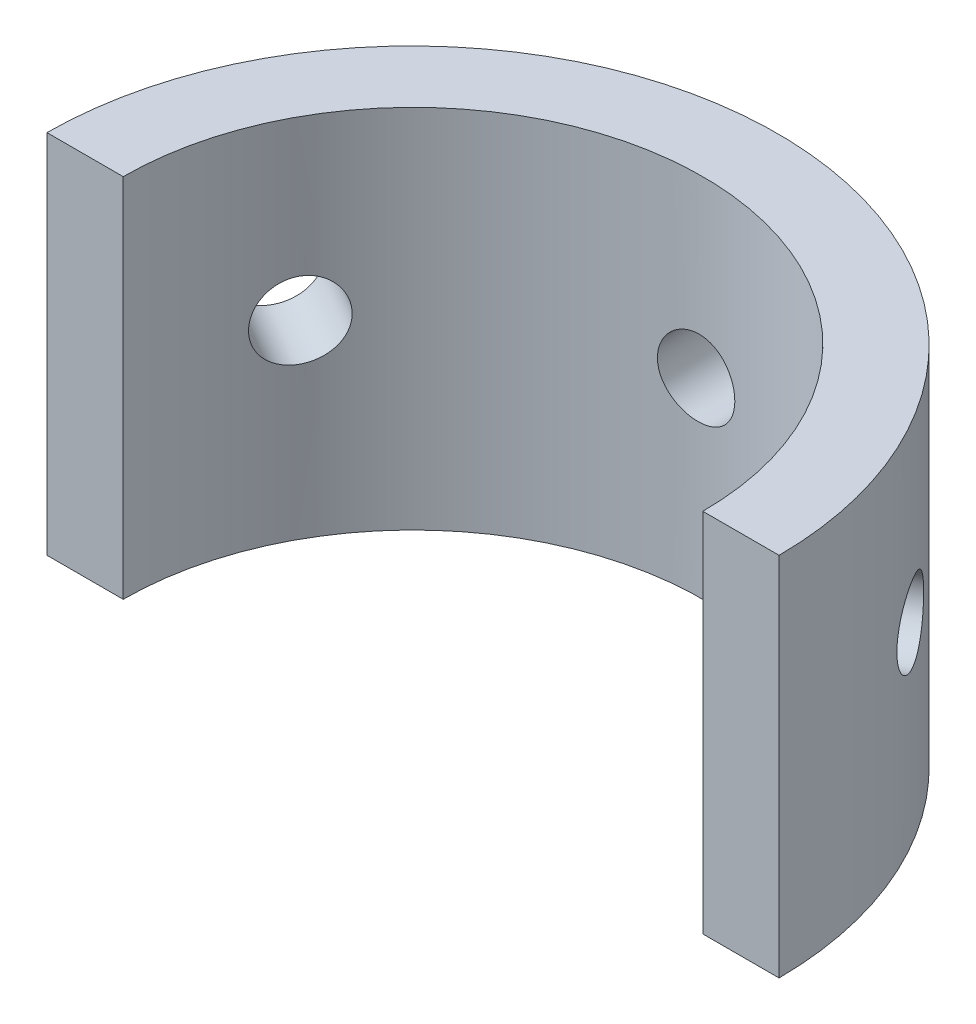
ISO-10303-21;
HEADER;
FILE_DESCRIPTION(('STEP AP214'),'2;1');
FILE_NAME('part.step','',(''),(''),'','','');
FILE_SCHEMA(('AUTOMOTIVE_DESIGN { 1 0 10303 214 1 1 1 1 }'));
ENDSEC;
DATA;
#1=APPLICATION_CONTEXT('core data for automotive mechanical design processes');
#2=APPLICATION_PROTOCOL_DEFINITION('international standard','automotive_design',2000,#1);
#3=PRODUCT_CONTEXT('',#1,'mechanical');
#4=PRODUCT('Part','Part','',(#3));
#5=PRODUCT_RELATED_PRODUCT_CATEGORY('part','',(#4));
#6=PRODUCT_DEFINITION_FORMATION('','',#4);
#7=PRODUCT_DEFINITION_CONTEXT('part definition',#1,'design');
#8=PRODUCT_DEFINITION('design','',#6,#7);
#9=PRODUCT_DEFINITION_SHAPE('','',#8);
#10=(LENGTH_UNIT() NAMED_UNIT(*) SI_UNIT(.MILLI.,.METRE.));
#11=(NAMED_UNIT(*) PLANE_ANGLE_UNIT() SI_UNIT($,.RADIAN.));
#12=(NAMED_UNIT(*) SI_UNIT($,.STERADIAN.) SOLID_ANGLE_UNIT());
#13=UNCERTAINTY_MEASURE_WITH_UNIT(LENGTH_MEASURE(1.E-05),#10,'distance_accuracy_value','');
#14=(GEOMETRIC_REPRESENTATION_CONTEXT(3) GLOBAL_UNCERTAINTY_ASSIGNED_CONTEXT((#13)) GLOBAL_UNIT_ASSIGNED_CONTEXT((#10,
#11,#12)) REPRESENTATION_CONTEXT('',''));
#15=CARTESIAN_POINT('',(0.,0.,0.));
#16=DIRECTION('',(0.,0.,1.));
#17=DIRECTION('',(1.,0.,0.));
#18=AXIS2_PLACEMENT_3D('',#15,#16,#17);
#19=CARTESIAN_POINT('',(-78.9587156753441,30.48,-2.73869468769838E-12));
#20=DIRECTION('',(0.,0.,-1.));
#21=DIRECTION('',(-1.,0.,0.));
#22=AXIS2_PLACEMENT_3D('',#19,#20,#21);
#23=PLANE('',#22);
#24=DIRECTION('',(0.,-1.,0.));
#25=VECTOR('',#24,1.);
#26=CARTESIAN_POINT('',(-24.3487156753441,30.48,-2.73869468769838E-12));
#27=LINE('',#26,#25);
#28=CARTESIAN_POINT('',(-24.3487156753441,0.,-2.73869468769838E-12));
#29=VERTEX_POINT('',#28);
#30=CARTESIAN_POINT('',(-24.3487156753441,30.48,-2.73869468769838E-12));
#31=VERTEX_POINT('',#30);
#32=EDGE_CURVE('E177',#29,#31,#27,.F.);
#33=ORIENTED_EDGE('',*,*,#32,.F.);
#34=DIRECTION('',(1.,0.,0.));
#35=VECTOR('',#34,1.);
#36=CARTESIAN_POINT('',(-78.9587156753441,0.,-2.73869468769838E-12));
#37=LINE('',#36,#35);
#38=CARTESIAN_POINT('',(-17.9987156753441,0.,-2.74482042997293E-12));
#39=VERTEX_POINT('',#38);
#40=EDGE_CURVE('E97',#29,#39,#37,.T.);
#41=ORIENTED_EDGE('',*,*,#40,.T.);
#42=DIRECTION('',(0.,-1.,0.));
#43=VECTOR('',#42,1.);
#44=CARTESIAN_POINT('',(-17.9987156753441,30.48,-2.74482042997293E-12));
#45=LINE('',#44,#43);
#46=CARTESIAN_POINT('',(-17.9987156753441,30.48,-2.74482042997293E-12));
#47=VERTEX_POINT('',#46);
#48=EDGE_CURVE('E11',#47,#39,#45,.T.);
#49=ORIENTED_EDGE('',*,*,#48,.F.);
#50=DIRECTION('',(1.,0.,0.));
#51=VECTOR('',#50,1.);
#52=CARTESIAN_POINT('',(-78.9587156753441,30.48,-2.73869468769838E-12));
#53=LINE('',#52,#51);
#54=EDGE_CURVE('E102',#31,#47,#53,.T.);
#55=ORIENTED_EDGE('',*,*,#54,.F.);
#56=EDGE_LOOP('',(#33,#41,#49,#55));
#57=FACE_BOUND('',#56,.T.);
#58=ADVANCED_FACE('F39',(#57),#23,.F.);
#59=DIRECTION('',(0.,-1.,0.));
#60=VECTOR('',#59,1.);
#61=CARTESIAN_POINT('',(-72.6087156753441,30.48,-2.73869468769838E-12));
#62=LINE('',#61,#60);
#63=CARTESIAN_POINT('',(-72.6087156753441,30.48,-2.73869468769838E-12));
#64=VERTEX_POINT('',#63);
#65=CARTESIAN_POINT('',(-72.6087156753441,0.,-2.73869468769838E-12));
#66=VERTEX_POINT('',#65);
#67=EDGE_CURVE('E61',#64,#66,#62,.T.);
#68=ORIENTED_EDGE('',*,*,#67,.F.);
#69=CARTESIAN_POINT('',(-78.9587156753441,30.48,-2.73736654003709E-12));
#70=VERTEX_POINT('',#69);
#71=EDGE_CURVE('E85',#70,#64,#53,.T.);
#72=ORIENTED_EDGE('',*,*,#71,.F.);
#73=DIRECTION('',(0.,-1.,0.));
#74=VECTOR('',#73,1.);
#75=CARTESIAN_POINT('',(-78.9587156753441,30.48,-2.73736654003709E-12));
#76=LINE('',#75,#74);
#77=CARTESIAN_POINT('',(-78.9587156753441,0.,-2.73736654003709E-12));
#78=VERTEX_POINT('',#77);
#79=EDGE_CURVE('E53',#70,#78,#76,.T.);
#80=ORIENTED_EDGE('',*,*,#79,.T.);
#81=EDGE_CURVE('E83',#78,#66,#37,.T.);
#82=ORIENTED_EDGE('',*,*,#81,.T.);
#83=EDGE_LOOP('',(#68,#72,#80,#82));
#84=FACE_BOUND('',#83,.T.);
#85=ADVANCED_FACE('F82',(#84),#23,.F.);
#86=CARTESIAN_POINT('',(-48.4787156753441,30.48,0.130335836696666));
#87=DIRECTION('',(0.,-1.,0.));
#88=DIRECTION('',(0.,0.,-1.));
#89=AXIS2_PLACEMENT_3D('',#86,#87,#88);
#90=CYLINDRICAL_SURFACE('',#89,30.4802786639218);
#91=CARTESIAN_POINT('',(-73.3467646108194,15.7989352991086,-17.4942926579167));
#92=CARTESIAN_POINT('',(-73.346770237791,15.6209873842544,-17.4942870608213));
#93=CARTESIAN_POINT('',(-73.3554916133903,15.4429228734124,-17.4819989610618));
#94=CARTESIAN_POINT('',(-73.3900389751096,15.0917298112064,-17.4330983540216));
#95=CARTESIAN_POINT('',(-73.415883652257,14.9186068694741,-17.3964592661584));
#96=CARTESIAN_POINT('',(-73.4835847740129,14.5824296934561,-17.2997350882543));
#97=CARTESIAN_POINT('',(-73.5254318663035,14.419369642622,-17.2396636923851));
#98=CARTESIAN_POINT('',(-73.6234216037065,14.1078406955678,-17.0975069857288));
#99=CARTESIAN_POINT('',(-73.6795614103432,13.9593689102813,-17.0154260457768));
#100=CARTESIAN_POINT('',(-73.8041044163524,13.6807213915714,-16.8309276464342));
#101=CARTESIAN_POINT('',(-73.8725420319882,13.5505988821954,-16.7284530251062));
#102=CARTESIAN_POINT('',(-74.0189657964422,13.3128069411958,-16.5057913799886));
#103=CARTESIAN_POINT('',(-74.0969523323885,13.2051384203708,-16.3856036380411));
#104=CARTESIAN_POINT('',(-74.2597296801126,13.0151856924689,-16.1303410647692));
#105=CARTESIAN_POINT('',(-74.3445293276488,12.9329351413807,-15.9952468139863));
#106=CARTESIAN_POINT('',(-74.5178754542668,12.796382256854,-15.7138059848958));
#107=CARTESIAN_POINT('',(-74.6064218283404,12.7420791407034,-15.5674597218505));
#108=CARTESIAN_POINT('',(-74.783997717073,12.6631471904409,-15.2680307350608));
#109=CARTESIAN_POINT('',(-74.8730241742117,12.6384078271272,-15.1149753348613));
#110=CARTESIAN_POINT('',(-75.0491572302263,12.6189450988681,-14.8058837923124));
#111=CARTESIAN_POINT('',(-75.1362638731693,12.6242210442364,-14.6498477185345));
#112=CARTESIAN_POINT('',(-75.3058550790225,12.6645523508899,-14.3397411557125));
#113=CARTESIAN_POINT('',(-75.3883527474614,12.6995181573616,-14.1856661684056));
#114=CARTESIAN_POINT('',(-75.5469453881087,12.7980787449647,-13.883495321835));
#115=CARTESIAN_POINT('',(-75.6230402294159,12.8616741112386,-13.7353995848451));
#116=CARTESIAN_POINT('',(-75.7673667003924,13.0158928428888,-13.4491600163141));
#117=CARTESIAN_POINT('',(-75.8355745671061,13.1065950804137,-13.3110467070209));
#118=CARTESIAN_POINT('',(-75.9625694558088,13.3123944463013,-13.0494345498947));
#119=CARTESIAN_POINT('',(-76.0213561524301,13.4274924168716,-12.92593620684));
#120=CARTESIAN_POINT('',(-76.1288168020913,13.6795068646793,-12.6968004103027));
#121=CARTESIAN_POINT('',(-76.1774387916613,13.8165294219541,-12.5912552239592));
#122=CARTESIAN_POINT('',(-76.2635081795571,14.1081405371132,-12.4021627543479));
#123=CARTESIAN_POINT('',(-76.3009556075523,14.2627290483571,-12.3186154126742));
#124=CARTESIAN_POINT('',(-76.364193088183,14.5850317520838,-12.1763138537606));
#125=CARTESIAN_POINT('',(-76.3899898207577,14.7527383584116,-12.1175454307874));
#126=CARTESIAN_POINT('',(-76.4296665339678,15.0965831310161,-12.0267284473381));
#127=CARTESIAN_POINT('',(-76.443547000198,15.2727209534071,-11.9946787980582));
#128=CARTESIAN_POINT('',(-76.4592003592086,15.6273263154925,-11.95851263085));
#129=CARTESIAN_POINT('',(-76.4610435079002,15.8057742346081,-11.9542340278659));
#130=CARTESIAN_POINT('',(-76.4527903123546,16.1609031400382,-11.9733264054362));
#131=CARTESIAN_POINT('',(-76.4426941825393,16.3375841580276,-11.9966968894306));
#132=CARTESIAN_POINT('',(-76.4107105602407,16.6836779060449,-12.0701818355872));
#133=CARTESIAN_POINT('',(-76.3888550084008,16.8531089886291,-12.1202238497639));
#134=CARTESIAN_POINT('',(-76.3336085938617,17.1804628017738,-12.2453248068305));
#135=CARTESIAN_POINT('',(-76.3002174071244,17.3383852089026,-12.3203844524682));
#136=CARTESIAN_POINT('',(-76.2221202340834,17.6390024381027,-12.4934476284027));
#137=CARTESIAN_POINT('',(-76.1773651536711,17.7816272686001,-12.5915505685484));
#138=CARTESIAN_POINT('',(-76.0772119043817,18.0468948383411,-12.8073807627539));
#139=CARTESIAN_POINT('',(-76.0218133743625,18.1695368992901,-12.9251086826891));
#140=CARTESIAN_POINT('',(-75.9009232869863,18.3919927911891,-13.1771626121757));
#141=CARTESIAN_POINT('',(-75.8353818593433,18.4916874207059,-13.3115699460787));
#142=CARTESIAN_POINT('',(-75.6956125376213,18.6646079546468,-13.592363405565));
#143=CARTESIAN_POINT('',(-75.6213847324555,18.7378341299692,-13.7387494085306));
#144=CARTESIAN_POINT('',(-75.465929619935,18.8556148299985,-14.0388619622023));
#145=CARTESIAN_POINT('',(-75.3847119948254,18.9002083140415,-14.1925782314647));
#146=CARTESIAN_POINT('',(-75.2171732761295,18.9595580612638,-14.502960367212));
#147=CARTESIAN_POINT('',(-75.1308523526635,18.9743153184672,-14.659626135256));
#148=CARTESIAN_POINT('',(-74.9559356739612,18.9735423941618,-14.9705203429083));
#149=CARTESIAN_POINT('',(-74.8673542629219,18.9581710243437,-15.124757265889));
#150=CARTESIAN_POINT('',(-74.6901244603575,18.8978921817387,-15.4273048914526));
#151=CARTESIAN_POINT('',(-74.6014760692308,18.8529848832448,-15.5756156290007));
#152=CARTESIAN_POINT('',(-74.42706918939,18.7350051339239,-15.8621140151593));
#153=CARTESIAN_POINT('',(-74.3413072068455,18.6619681713478,-16.0003141588776));
#154=CARTESIAN_POINT('',(-74.1754688185617,18.4898117637506,-16.2632132577801));
#155=CARTESIAN_POINT('',(-74.0953923679459,18.3906925246285,-16.3879123195338));
#156=CARTESIAN_POINT('',(-73.9434819243289,18.1687297176272,-16.6211580754324));
#157=CARTESIAN_POINT('',(-73.8716812711942,18.0457951937668,-16.7296399244066));
#158=CARTESIAN_POINT('',(-73.7393636480442,17.779868479349,-16.927249962422));
#159=CARTESIAN_POINT('',(-73.6788493960207,17.6368714718336,-17.0163734904397));
#160=CARTESIAN_POINT('',(-73.5713242271555,17.3343952984929,-17.1733485161616));
#161=CARTESIAN_POINT('',(-73.524355845191,17.1748663076859,-17.2411330678542));
#162=CARTESIAN_POINT('',(-73.4461314193091,16.8443154320387,-17.3533783421941));
#163=CARTESIAN_POINT('',(-73.4148578964056,16.6733065738633,-17.3978650135445));
#164=CARTESIAN_POINT('',(-73.3770495340648,16.384280746551,-17.451501304109));
#165=CARTESIAN_POINT('',(-73.3657141999391,16.2680996090353,-17.4675295450481));
#166=CARTESIAN_POINT('',(-73.3505698913014,16.0342744121899,-17.4889270533307));
#167=CARTESIAN_POINT('',(-73.3467608891306,15.916630358238,-17.4942963598452));
#168=CARTESIAN_POINT('',(-73.3467646108194,15.7989352991086,-17.4942926579167));
#169=B_SPLINE_CURVE_WITH_KNOTS('',3,(#91,#92,#93,#94,#95,#96,#97,#98,#99,#100,#101,#102,#103,
#104,#105,#106,#107,#108,#109,#110,#111,#112,#113,#114,#115,#116,#117,#118,#119,#120,#121,#122,
#123,#124,#125,#126,#127,#128,#129,#130,#131,#132,#133,#134,#135,#136,#137,#138,#139,#140,#141,
#142,#143,#144,#145,#146,#147,#148,#149,#150,#151,#152,#153,#154,#155,#156,#157,#158,#159,#160,
#161,#162,#163,#164,#165,#166,#167,#168),.UNSPECIFIED.,.T.,.F.,(4,2,2,2,2,2,2,2,2,2,2,2,2,2,2,2,
2,2,2,2,2,2,2,2,2,2,2,2,2,2,2,2,2,2,2,2,2,2,4),(0.,0.533414256726589,1.06741172590308,
1.6010975858472,2.13467754048085,2.66977469505046,3.2048935504836,3.74071795169633,
4.27652734548314,4.81032719257647,5.34411477416249,5.87629796547446,6.40849203425385,
6.94224994542831,7.47602628639548,8.01246802137171,8.54890833204197,9.0850406823874,
9.6211511839929,10.1541298540337,10.6870989522611,11.218627667818,11.7501713153273,
12.2840516059505,12.8179500148186,13.3545621594635,13.8911688118602,14.4270437694691,
14.9629008735669,15.4959410042976,16.0289779895595,16.5613446891148,17.0937071861825,
17.6281444751876,18.1627103016953,18.6989368641406,19.2345649113686,19.58736732129,
19.9401684346792),.UNSPECIFIED.);
#170=CARTESIAN_POINT('',(-73.3467646108194,15.7989352991086,-17.4942926579167));
#171=VERTEX_POINT('',#170);
#172=EDGE_CURVE('E116',#171,#171,#169,.T.);
#173=ORIENTED_EDGE('',*,*,#172,.F.);
#174=EDGE_LOOP('',(#173));
#175=FACE_BOUND('',#174,.T.);
#176=CARTESIAN_POINT('',(-20.7813151990084,15.7989352991086,-12.5937120366731));
#177=CARTESIAN_POINT('',(-20.7813172327493,15.6209873842544,-12.5937197083211));
#178=CARTESIAN_POINT('',(-20.7875983515057,15.4429228734124,-12.6074166910259));
#179=CARTESIAN_POINT('',(-20.8126738386033,15.0917298112064,-12.6617858874285));
#180=CARTESIAN_POINT('',(-20.8314818808906,14.9186068694741,-12.7024875783224));
#181=CARTESIAN_POINT('',(-20.8813969152378,14.5824296934561,-12.8094805585798));
#182=CARTESIAN_POINT('',(-20.912496723956,14.419369642622,-12.8757569015125));
#183=CARTESIAN_POINT('',(-20.9866131745372,14.1078406955678,-13.0316968567419));
#184=CARTESIAN_POINT('',(-21.0296274503838,13.9593689102813,-13.1213558254288));
#185=CARTESIAN_POINT('',(-21.1271362481675,13.6807213915714,-13.3214624321677));
#186=CARTESIAN_POINT('',(-21.1816630656628,13.5505988821954,-13.4319684565467));
#187=CARTESIAN_POINT('',(-21.3012818245561,13.3128069411958,-13.6701059788404));
#188=CARTESIAN_POINT('',(-21.3663741943329,13.2051384203708,-13.7977381710969));
#189=CARTESIAN_POINT('',(-21.5060493935598,13.0151856924689,-14.0663387760225));
#190=CARTESIAN_POINT('',(-21.5806446228748,12.9329351413807,-14.2073245504123));
#191=CARTESIAN_POINT('',(-21.7377064672204,12.796382256854,-14.4981671142564));
#192=CARTESIAN_POINT('',(-21.8201728617297,12.7420791407034,-14.6480236551398));
#193=CARTESIAN_POINT('',(-21.9906980265527,12.6631471904409,-14.9515233792767));
#194=CARTESIAN_POINT('',(-22.0787346627426,12.6384078271272,-15.1051502528674));
#195=CARTESIAN_POINT('',(-22.2583492626776,12.6189450988681,-15.4122317250968));
#196=CARTESIAN_POINT('',(-22.3499271450045,12.6242210442364,-15.5656863276127));
#197=CARTESIAN_POINT('',(-22.533691703362,12.6645523508899,-15.867609901551));
#198=CARTESIAN_POINT('',(-22.6258757222381,12.6995181573616,-16.0160924718255));
#199=CARTESIAN_POINT('',(-22.8082670313276,12.7980787449647,-16.3045231507646));
#200=CARTESIAN_POINT('',(-22.8984742810995,12.8616741112386,-16.4444710849286));
#201=CARTESIAN_POINT('',(-23.0742017835273,13.0158928428888,-16.7125812594983));
#202=CARTESIAN_POINT('',(-23.1597074846192,13.1065950804137,-16.8407076594569));
#203=CARTESIAN_POINT('',(-23.322772814278,13.3123944463013,-17.0814945377873));
#204=CARTESIAN_POINT('',(-23.400332168378,13.4274924168716,-17.1941544819932));
#205=CARTESIAN_POINT('',(-23.5450392642651,13.6795068646793,-17.4017860327757));
#206=CARTESIAN_POINT('',(-23.6121330821007,13.8165294219541,-17.4966665040976));
#207=CARTESIAN_POINT('',(-23.7328572705005,14.1081405371132,-17.6657510153092));
#208=CARTESIAN_POINT('',(-23.786487676811,14.2627290483571,-17.7399551100962));
#209=CARTESIAN_POINT('',(-23.8781057015129,14.5850317520838,-17.8658711542506));
#210=CARTESIAN_POINT('',(-23.9161022824607,14.7527383584116,-17.9175959914815));
#211=CARTESIAN_POINT('',(-23.9749137406178,15.0965831310161,-17.9973655247848));
#212=CARTESIAN_POINT('',(-23.9957293179616,15.2727209534071,-18.0254111857964));
#213=CARTESIAN_POINT('',(-24.0192234580161,15.6273263154925,-18.0570504759583));
#214=CARTESIAN_POINT('',(-24.0220072625472,15.8057742346081,-18.0607859910402));
#215=CARTESIAN_POINT('',(-24.0095993763254,16.1609031400382,-18.0440923252501));
#216=CARTESIAN_POINT('',(-23.9944080083952,16.3375841580276,-18.023663578353));
#217=CARTESIAN_POINT('',(-23.9467599893772,16.6836779060449,-17.959222475859));
#218=CARTESIAN_POINT('',(-23.9143501097636,16.8531089886291,-17.9152740056636));
#219=CARTESIAN_POINT('',(-23.8336327101757,17.1804628017738,-17.8048787286715));
#220=CARTESIAN_POINT('',(-23.785324743623,17.3383852089026,-17.7384312898756));
#221=CARTESIAN_POINT('',(-23.6744962233247,17.6390024381027,-17.5842655660911));
#222=CARTESIAN_POINT('',(-23.6119141251786,17.7816272686001,-17.4964550594328));
#223=CARTESIAN_POINT('',(-23.4750763187377,18.0468948383411,-17.3018047041738));
#224=CARTESIAN_POINT('',(-23.4008202143486,18.1695368992901,-17.1949642098773));
#225=CARTESIAN_POINT('',(-23.2429801519778,18.3919927911891,-16.9642433584005));
#226=CARTESIAN_POINT('',(-23.1593507001842,18.4916874207059,-16.8402791501099));
#227=CARTESIAN_POINT('',(-22.9860610919136,18.6646079546468,-16.5788386370858));
#228=CARTESIAN_POINT('',(-22.8964009971699,18.7378341299692,-16.4413624706622));
#229=CARTESIAN_POINT('',(-22.7142234579557,18.8556148299985,-16.1566781172355));
#230=CARTESIAN_POINT('',(-22.6217100763544,18.9002083140415,-16.0094834560243));
#231=CARTESIAN_POINT('',(-22.4366806212642,18.9595580612638,-15.7091996016425));
#232=CARTESIAN_POINT('',(-22.3441645479678,18.9743153184672,-15.5561106050209));
#233=CARTESIAN_POINT('',(-22.1623806056026,18.9735423941618,-15.2491812138929));
#234=CARTESIAN_POINT('',(-22.0730982176194,18.9581710243437,-15.0953490001394));
#235=CARTESIAN_POINT('',(-21.8996991893089,18.8978921817387,-14.7905896760292));
#236=CARTESIAN_POINT('',(-21.8155825185016,18.8529848832448,-14.6396625485347));
#237=CARTESIAN_POINT('',(-21.6546710778654,18.7350051339239,-14.3453725669186));
#238=CARTESIAN_POINT('',(-21.5778672338709,18.6619681713478,-14.202000439497));
#239=CARTESIAN_POINT('',(-21.4331091297312,18.4898117637506,-13.9269306328692));
#240=CARTESIAN_POINT('',(-21.3651547997323,18.3906925246285,-13.7952328615143));
#241=CARTESIAN_POINT('',(-21.2391132716077,18.1687297176272,-13.5470516802924));
#242=CARTESIAN_POINT('',(-21.1810655611139,18.0457951937668,-13.4306295661824));
#243=CARTESIAN_POINT('',(-21.0760890597247,17.779868479349,-13.2172341241584));
#244=CARTESIAN_POINT('',(-21.0291629463982,17.6368714718336,-13.1202654806062));
#245=CARTESIAN_POINT('',(-20.946981170796,17.3343952984929,-12.9486584399618));
#246=CARTESIAN_POINT('',(-20.9117622180283,17.1748663076859,-12.8740903521596));
#247=CARTESIAN_POINT('',(-20.8536671719361,16.8443154320387,-12.7502233749795));
#248=CARTESIAN_POINT('',(-20.8307773458687,16.6733065738633,-12.7008963740039));
#249=CARTESIAN_POINT('',(-20.8032311368454,16.384280746551,-12.6413352264591));
#250=CARTESIAN_POINT('',(-20.795017940077,16.2680996090353,-12.6235044186763));
#251=CARTESIAN_POINT('',(-20.7840593086454,16.0342744121899,-12.599690308532));
#252=CARTESIAN_POINT('',(-20.7813138538886,15.916630358238,-12.5937069626317));
#253=CARTESIAN_POINT('',(-20.7813151990084,15.7989352991086,-12.5937120366731));
#254=B_SPLINE_CURVE_WITH_KNOTS('',3,(#176,#177,#178,#179,#180,#181,#182,#183,#184,#185,#186,
#187,#188,#189,#190,#191,#192,#193,#194,#195,#196,#197,#198,#199,#200,#201,#202,#203,#204,#205,
#206,#207,#208,#209,#210,#211,#212,#213,#214,#215,#216,#217,#218,#219,#220,#221,#222,#223,#224,
#225,#226,#227,#228,#229,#230,#231,#232,#233,#234,#235,#236,#237,#238,#239,#240,#241,#242,#243,
#244,#245,#246,#247,#248,#249,#250,#251,#252,#253),.UNSPECIFIED.,.T.,.F.,(4,2,2,2,2,2,2,2,2,2,2,
2,2,2,2,2,2,2,2,2,2,2,2,2,2,2,2,2,2,2,2,2,2,2,2,2,2,2,4),(0.,0.533414256726587,1.06741172590307,
1.60109758584721,2.13467754048085,2.66977469505046,3.2048935504836,3.74071795169634,
4.27652734548314,4.81032719257648,5.3441147741625,5.87629796547445,6.40849203425385,
6.94224994542831,7.47602628639549,8.01246802137172,8.54890833204197,9.0850406823874,
9.62115118399289,10.1541298540337,10.6870989522611,11.218627667818,11.7501713153273,
12.2840516059504,12.8179500148186,13.3545621594635,13.8911688118601,14.4270437694691,
14.9629008735669,15.4959410042976,16.0289779895595,16.5613446891148,17.0937071861825,
17.6281444751876,18.1627103016953,18.6989368641406,19.2345649113686,19.58736732129,
19.9401684346792),.UNSPECIFIED.);
#255=CARTESIAN_POINT('',(-20.7813151990084,15.7989352991086,-12.5937120366731));
#256=VERTEX_POINT('',#255);
#257=EDGE_CURVE('E154',#256,#256,#254,.T.);
#258=ORIENTED_EDGE('',*,*,#257,.F.);
#259=EDGE_LOOP('',(#258));
#260=FACE_BOUND('',#259,.T.);
#261=CARTESIAN_POINT('',(-45.6493641344834,15.7989352991086,-30.2183405312861));
#262=CARTESIAN_POINT('',(-45.6493717951961,15.6209873842544,-30.2183426058388));
#263=CARTESIAN_POINT('',(-45.6643742895517,15.4429228734124,-30.219751488784));
#264=CARTESIAN_POINT('',(-45.7239971383686,15.0917298112064,-30.2252200781465));
#265=CARTESIAN_POINT('',(-45.7686498578033,14.9186068694741,-30.2292826811772));
#266=CARTESIAN_POINT('',(-45.8862660139064,14.5824296934561,-30.2395514835305));
#267=CARTESIAN_POINT('',(-45.9592129149151,14.419369642622,-30.2457564305941));
#268=CARTESIAN_POINT('',(-46.1313191028994,14.1078406955678,-30.2595396791671));
#269=CARTESIAN_POINT('',(-46.2304731853827,13.9593689102813,-30.267117707902));
#270=CARTESIAN_POINT('',(-46.4525249891755,13.6807213915714,-30.2827259152983));
#271=CARTESIAN_POINT('',(-46.5754894223067,13.5505988821954,-30.2907573183493));
#272=CARTESIAN_POINT('',(-46.8415319456539,13.3128069411958,-30.3062331955255));
#273=CARTESIAN_POINT('',(-46.9846108513771,13.2051384203708,-30.3136776458344));
#274=CARTESIAN_POINT('',(-47.287063398328,13.0151856924689,-30.3270156774881));
#275=CARTESIAN_POINT('',(-47.4464582751793,12.9329351413807,-30.3329072010951));
#276=CARTESIAN_POINT('',(-47.7768662461429,12.796382256854,-30.3423089358486));
#277=CARTESIAN_POINT('',(-47.9478790147258,12.7420791407034,-30.3458192136867));
#278=CARTESIAN_POINT('',(-48.2959800682815,12.6631471904409,-30.3498899510339));
#279=CARTESIAN_POINT('',(-48.47304316161,12.6384078271272,-30.3504614244251));
#280=CARTESIAN_POINT('',(-48.8287908175596,12.6189450988681,-30.3484513541055));
#281=CARTESIAN_POINT('',(-49.0074753428295,12.6242210442364,-30.3458698828436));
#282=CARTESIAN_POINT('',(-49.3608311070401,12.6645523508899,-30.3376868939599));
#283=CARTESIAN_POINT('',(-49.5355127943551,12.6995181573616,-30.3320944769275));
#284=CARTESIAN_POINT('',(-49.876496744092,12.7980787449647,-30.3183543092961));
#285=CARTESIAN_POINT('',(-50.0427988351711,12.8616741112386,-30.3102065064701));
#286=CARTESIAN_POINT('',(-50.3628528085754,13.0158928428888,-30.2920771125088));
#287=CARTESIAN_POINT('',(-50.516566376381,13.1065950804137,-30.2820902031742));
#288=CARTESIAN_POINT('',(-50.8066265947424,13.3123944463013,-30.2612649243784));
#289=CARTESIAN_POINT('',(-50.9429726454637,13.4274924168716,-30.2504265255297));
#290=CARTESIAN_POINT('',(-51.1951403910121,13.6795068646793,-30.2289222797748));
#291=CARTESIAN_POINT('',(-51.3108561984177,13.8165294219541,-30.2182575647532));
#292=CARTESIAN_POINT('',(-51.5176497747133,14.1081405371132,-30.1982496063535));
#293=CARTESIAN_POINT('',(-51.6087276090189,14.2627290483571,-30.1889063594669));
#294=CARTESIAN_POINT('',(-51.7635831143516,14.5850317520838,-30.1725208447076));
#295=CARTESIAN_POINT('',(-51.8273764278741,14.7527383584116,-30.1654772589653));
#296=CARTESIAN_POINT('',(-51.9258645992413,15.0965831310161,-30.1544298088193));
#297=CARTESIAN_POINT('',(-51.9605606428151,15.2727209534071,-30.150425820551));
#298=CARTESIAN_POINT('',(-51.9997081418803,15.6273263154925,-30.1458989435047));
#299=CARTESIAN_POINT('',(-52.004335095103,15.8057742346081,-30.1453558556025));
#300=CARTESIAN_POINT('',(-51.9836740133357,16.1609031400382,-30.1477545673828));
#301=CARTESIAN_POINT('',(-51.9583865155902,16.3375841580276,-30.15069630448));
#302=CARTESIAN_POINT('',(-51.8787548742735,16.6836779060449,-30.1597401481427));
#303=CARTESIAN_POINT('',(-51.82448944282,16.8531089886291,-30.165833692124));
#304=CARTESIAN_POINT('',(-51.688525628693,17.1804628017738,-30.1805393721984));
#305=CARTESIAN_POINT('',(-51.6068264754031,17.3383852089026,-30.1891515790403));
#306=CARTESIAN_POINT('',(-51.4179007820637,17.6390024381027,-30.2080490311902));
#307=CARTESIAN_POINT('',(-51.3105636035054,17.7816272686001,-30.2183414646777));
#308=CARTESIAN_POINT('',(-51.073572547775,18.0468948383411,-30.2395213036242));
#309=CARTESIAN_POINT('',(-50.9439179133668,18.1695368992901,-30.2504087292629));
#310=CARTESIAN_POINT('',(-50.6651877636197,18.3919927911891,-30.2717418072726));
#311=CARTESIAN_POINT('',(-50.5160168841832,18.4916874207059,-30.2821849328851));
#312=CARTESIAN_POINT('',(-50.2029579541906,18.6646079546468,-30.3015378793472));
#313=CARTESIAN_POINT('',(-50.039070054281,18.7378341299692,-30.3104477158892));
#314=CARTESIAN_POINT('',(-49.7014374025464,18.8556148299985,-30.3258759161342));
#315=CARTESIAN_POINT('',(-49.5277063958354,18.9002083140415,-30.3323975241854));
#316=CARTESIAN_POINT('',(-49.1751382220494,18.9595580612638,-30.342495805551));
#317=CARTESIAN_POINT('',(-48.996301225287,18.9743153184672,-30.3460725769732));
#318=CARTESIAN_POINT('',(-48.6396006042195,18.9735423941618,-30.3500373934976));
#319=CARTESIAN_POINT('',(-48.461736805197,18.9581710243437,-30.3504421027249));
#320=CARTESIAN_POINT('',(-48.111107974322,18.8978921817387,-30.3482304041782));
#321=CARTESIAN_POINT('',(-47.938342912388,18.8529848832448,-30.3456140142318));
#322=CARTESIAN_POINT('',(-47.6030245919111,18.7350051339239,-30.3378224187743));
#323=CARTESIAN_POINT('',(-47.4404587653721,18.6619681713478,-30.332650435071));
#324=CARTESIAN_POINT('',(-47.1298622729486,18.4898117637506,-30.3204797273458));
#325=CARTESIAN_POINT('',(-46.9818314923339,18.3906925246285,-30.3134810177444));
#326=CARTESIAN_POINT('',(-46.7038795205923,18.1687297176272,-30.2985455924213));
#327=CARTESIAN_POINT('',(-46.5740311569638,18.0457951937668,-30.2906053272854));
#328=CARTESIAN_POINT('',(-46.3367370324247,17.779868479349,-30.2748199232769));
#329=CARTESIAN_POINT('',(-46.2292966670746,17.6368714718336,-30.2669748077423));
#330=CARTESIAN_POINT('',(-46.0395897226072,17.3343952984929,-30.2523427928197));
#331=CARTESIAN_POINT('',(-45.957402387875,17.1748663076859,-30.2455592567102));
#332=CARTESIAN_POINT('',(-45.821082915901,16.8443154320387,-30.23393755387));
#333=CARTESIAN_POINT('',(-45.7669195669299,16.6733065738633,-30.2290972242448));
#334=CARTESIAN_POINT('',(-45.7015649955659,16.384280746551,-30.2231723672645));
#335=CARTESIAN_POINT('',(-45.6820164646718,16.2680996090353,-30.2213698004208));
#336=CARTESIAN_POINT('',(-45.6559135246025,16.0342744121899,-30.2189531985591));
#337=CARTESIAN_POINT('',(-45.6493590676749,15.916630358238,-30.2183391591733));
#338=CARTESIAN_POINT('',(-45.6493641344834,15.7989352991086,-30.2183405312861));
#339=B_SPLINE_CURVE_WITH_KNOTS('',3,(#261,#262,#263,#264,#265,#266,#267,#268,#269,#270,#271,
#272,#273,#274,#275,#276,#277,#278,#279,#280,#281,#282,#283,#284,#285,#286,#287,#288,#289,#290,
#291,#292,#293,#294,#295,#296,#297,#298,#299,#300,#301,#302,#303,#304,#305,#306,#307,#308,#309,
#310,#311,#312,#313,#314,#315,#316,#317,#318,#319,#320,#321,#322,#323,#324,#325,#326,#327,#328,
#329,#330,#331,#332,#333,#334,#335,#336,#337,#338),.UNSPECIFIED.,.T.,.F.,(4,2,2,2,2,2,2,2,2,2,2,
2,2,2,2,2,2,2,2,2,2,2,2,2,2,2,2,2,2,2,2,2,2,2,2,2,2,2,4),(0.,0.533414256726587,1.06741172590307,
1.60109758584721,2.13467754048085,2.66977469505046,3.2048935504836,3.74071795169634,
4.27652734548314,4.81032719257647,5.34411477416249,5.87629796547445,6.40849203425385,
6.9422499454283,7.47602628639548,8.01246802137171,8.54890833204196,9.0850406823874,
9.62115118399289,10.1541298540337,10.6870989522611,11.218627667818,11.7501713153273,
12.2840516059504,12.8179500148186,13.3545621594635,13.8911688118601,14.4270437694691,
14.9629008735669,15.4959410042976,16.0289779895595,16.5613446891148,17.0937071861825,
17.6281444751876,18.1627103016953,18.6989368641406,19.2345649113686,19.58736732129,
19.9401684346792),.UNSPECIFIED.);
#340=CARTESIAN_POINT('',(-45.6493641344834,15.7989352991086,-30.2183405312861));
#341=VERTEX_POINT('',#340);
#342=EDGE_CURVE('E115',#341,#341,#339,.T.);
#343=ORIENTED_EDGE('',*,*,#342,.F.);
#344=EDGE_LOOP('',(#343));
#345=FACE_BOUND('',#344,.T.);
#346=CARTESIAN_POINT('',(-48.4787156753441,0.,0.130335836696666));
#347=DIRECTION('',(0.,-1.,0.));
#348=DIRECTION('',(0.,0.,-1.));
#349=AXIS2_PLACEMENT_3D('',#346,#347,#348);
#350=CIRCLE('',#349,30.4802786639218);
#351=EDGE_CURVE('E94',#78,#39,#350,.T.);
#352=ORIENTED_EDGE('',*,*,#351,.F.);
#353=ORIENTED_EDGE('',*,*,#79,.F.);
#354=CARTESIAN_POINT('',(-48.4787156753441,30.48,0.130335836696666));
#355=DIRECTION('',(0.,-1.,0.));
#356=DIRECTION('',(0.,0.,-1.));
#357=AXIS2_PLACEMENT_3D('',#354,#355,#356);
#358=CIRCLE('',#357,30.4802786639218);
#359=EDGE_CURVE('E88',#70,#47,#358,.T.);
#360=ORIENTED_EDGE('',*,*,#359,.T.);
#361=ORIENTED_EDGE('',*,*,#48,.T.);
#362=EDGE_LOOP('',(#352,#353,#360,#361));
#363=FACE_BOUND('',#362,.T.);
#364=ADVANCED_FACE('F99',(#175,#260,#345,#363),#90,.T.);
#365=CARTESIAN_POINT('',(-48.4787156753441,30.48,0.130335836696666));
#366=DIRECTION('',(0.,-1.,0.));
#367=DIRECTION('',(0.,0.,-1.));
#368=AXIS2_PLACEMENT_3D('',#365,#366,#367);
#369=PLANE('',#368);
#370=CARTESIAN_POINT('',(-48.4787156753441,30.48,0.));
#371=DIRECTION('',(0.,1.,0.));
#372=DIRECTION('',(0.,0.,1.));
#373=AXIS2_PLACEMENT_3D('',#370,#371,#372);
#374=CIRCLE('',#373,24.13);
#375=EDGE_CURVE('E145',#31,#64,#374,.T.);
#376=ORIENTED_EDGE('',*,*,#375,.F.);
#377=ORIENTED_EDGE('',*,*,#54,.T.);
#378=ORIENTED_EDGE('',*,*,#359,.F.);
#379=ORIENTED_EDGE('',*,*,#71,.T.);
#380=EDGE_LOOP('',(#376,#377,#378,#379));
#381=FACE_BOUND('',#380,.T.);
#382=ADVANCED_FACE('F150',(#381),#369,.F.);
#383=CARTESIAN_POINT('',(-48.4787156753441,0.,0.130335836696666));
#384=DIRECTION('',(0.,-1.,0.));
#385=DIRECTION('',(0.,0.,-1.));
#386=AXIS2_PLACEMENT_3D('',#383,#384,#385);
#387=PLANE('',#386);
#388=ORIENTED_EDGE('',*,*,#40,.F.);
#389=CARTESIAN_POINT('',(-48.4787156753441,0.,0.));
#390=DIRECTION('',(0.,1.,0.));
#391=DIRECTION('',(0.,0.,1.));
#392=AXIS2_PLACEMENT_3D('',#389,#390,#391);
#393=CIRCLE('',#392,24.13);
#394=EDGE_CURVE('E95',#29,#66,#393,.T.);
#395=ORIENTED_EDGE('',*,*,#394,.T.);
#396=ORIENTED_EDGE('',*,*,#81,.F.);
#397=ORIENTED_EDGE('',*,*,#351,.T.);
#398=EDGE_LOOP('',(#388,#395,#396,#397));
#399=FACE_BOUND('',#398,.T.);
#400=ADVANCED_FACE('F93',(#399),#387,.T.);
#401=CARTESIAN_POINT('',(-48.4787156753441,30.48,0.));
#402=DIRECTION('',(0.,-1.,0.));
#403=DIRECTION('',(0.,0.,-1.));
#404=AXIS2_PLACEMENT_3D('',#401,#402,#403);
#405=CYLINDRICAL_SURFACE('',#404,24.13);
#406=CARTESIAN_POINT('',(-67.8848271462321,15.7989352991086,-14.3408415924403));
#407=CARTESIAN_POINT('',(-67.8848330493525,15.976708684779,-14.3408363934761));
#408=CARTESIAN_POINT('',(-67.8937999509864,16.1545910737161,-14.3287240446166));
#409=CARTESIAN_POINT('',(-67.9292877161787,16.5054076537422,-14.2805115099779));
#410=CARTESIAN_POINT('',(-67.955826596734,16.678336575858,-14.2443867034662));
#411=CARTESIAN_POINT('',(-68.0252464786371,17.0141243571559,-14.1489749603041));
#412=CARTESIAN_POINT('',(-68.0681171644456,17.1769894975397,-14.0897026435543));
#413=CARTESIAN_POINT('',(-68.1683196245945,17.488171259652,-13.9493296469931));
#414=CARTESIAN_POINT('',(-68.2256489225875,17.6364903666651,-13.8682327049573));
#415=CARTESIAN_POINT('',(-68.3526328938159,17.915089283264,-13.6856383168809));
#416=CARTESIAN_POINT('',(-68.4223378059407,18.0452915518383,-13.5840574790197));
#417=CARTESIAN_POINT('',(-68.571097451863,18.2832809333879,-13.363038675696));
#418=CARTESIAN_POINT('',(-68.6501525487518,18.3910671754432,-13.2436000167212));
#419=CARTESIAN_POINT('',(-68.81470565726,18.5813225295416,-12.9895082533104));
#420=CARTESIAN_POINT('',(-68.9002142149478,18.6637490327913,-12.854830057362));
#421=CARTESIAN_POINT('',(-69.0744189259706,18.800644670011,-12.5738300982449));
#422=CARTESIAN_POINT('',(-69.1631149378638,18.8551150428859,-12.427508851382));
#423=CARTESIAN_POINT('',(-69.3401105655548,18.9342631816434,-12.128032060471));
#424=CARTESIAN_POINT('',(-69.4284093835314,18.9591170042714,-11.9749225723238));
#425=CARTESIAN_POINT('',(-69.6023715802746,18.9789110355867,-11.6653154199847));
#426=CARTESIAN_POINT('',(-69.6880350446833,18.9738522173915,-11.5088178661783));
#427=CARTESIAN_POINT('',(-69.8539643623388,18.9341004945576,-11.1976165507151));
#428=CARTESIAN_POINT('',(-69.9342519471069,18.8995357834079,-11.0429079593094));
#429=CARTESIAN_POINT('',(-70.0879093053378,18.8019923092886,-10.7391176235806));
#430=CARTESIAN_POINT('',(-70.1612788425623,18.739012576423,-10.5900360715146));
#431=CARTESIAN_POINT('',(-70.2999942060734,18.5860703922501,-10.3011907588438));
#432=CARTESIAN_POINT('',(-70.3652967685824,18.4959706631525,-10.1614789335928));
#433=CARTESIAN_POINT('',(-70.4863935670407,18.2914478177628,-9.89647779630067));
#434=CARTESIAN_POINT('',(-70.5421872630785,18.1770233211442,-9.77118930334413));
#435=CARTESIAN_POINT('',(-70.6439936672704,17.9259838479777,-9.53801348273754));
#436=CARTESIAN_POINT('',(-70.6899235898013,17.7891968281958,-9.43027514102813));
#437=CARTESIAN_POINT('',(-70.7710018709941,17.4978941776428,-9.23698529046655));
#438=CARTESIAN_POINT('',(-70.8061502886968,17.3433786439614,-9.15143366011785));
#439=CARTESIAN_POINT('',(-70.8653928826003,17.021137914508,-9.00554307129608));
#440=CARTESIAN_POINT('',(-70.8895007041796,16.8534293265869,-8.94517299851895));
#441=CARTESIAN_POINT('',(-70.926602712238,16.5094145678761,-8.8516565100794));
#442=CARTESIAN_POINT('',(-70.939597683523,16.333109005147,-8.81850817198448));
#443=CARTESIAN_POINT('',(-70.9543495854197,15.9787880785596,-8.78084230027268));
#444=CARTESIAN_POINT('',(-70.9562172634037,15.8008072843601,-8.77604262316214));
#445=CARTESIAN_POINT('',(-70.9490038980127,15.446534586843,-8.79449496688228));
#446=CARTESIAN_POINT('',(-70.9399231890421,15.2702426321076,-8.81774613093611));
#447=CARTESIAN_POINT('',(-70.910916587282,14.9251911324432,-8.8912764325573));
#448=CARTESIAN_POINT('',(-70.8910415249524,14.7564002637505,-8.94142887877188));
#449=CARTESIAN_POINT('',(-70.8405690373093,14.4301659134056,-9.06691574163965));
#450=CARTESIAN_POINT('',(-70.8099711245004,14.272722948058,-9.14225130319113));
#451=CARTESIAN_POINT('',(-70.7379666569444,13.9723805077614,-9.31619760882252));
#452=CARTESIAN_POINT('',(-70.6964823439232,13.8295963804182,-9.41497528662464));
#453=CARTESIAN_POINT('',(-70.60314479211,13.5637947286108,-9.63226264826262));
#454=CARTESIAN_POINT('',(-70.5512909508627,13.4407783533754,-9.75077347850067));
#455=CARTESIAN_POINT('',(-70.4372734126727,13.2168902386391,-10.0049073867835));
#456=CARTESIAN_POINT('',(-70.3750224391979,13.1162243617932,-10.1406727790349));
#457=CARTESIAN_POINT('',(-70.241456254267,12.9413000706637,-10.4242289987868));
#458=CARTESIAN_POINT('',(-70.1701411509633,12.867041341332,-10.5720196827947));
#459=CARTESIAN_POINT('',(-70.0199161579883,12.7472093380926,-10.8748367982168));
#460=CARTESIAN_POINT('',(-69.9410192239283,12.7015881000275,-11.0298506612964));
#461=CARTESIAN_POINT('',(-69.7773532090411,12.6402297358216,-11.3426663576161));
#462=CARTESIAN_POINT('',(-69.6925844559906,12.6244909429742,-11.5004680348691));
#463=CARTESIAN_POINT('',(-69.5202222836769,12.623413261506,-11.8128511845856));
#464=CARTESIAN_POINT('',(-69.432659463455,12.6378138345779,-11.9674486842062));
#465=CARTESIAN_POINT('',(-69.2566665916842,12.6960915959376,-12.2704671580793));
#466=CARTESIAN_POINT('',(-69.1682365529309,12.7399683499534,-12.4188882232948));
#467=CARTESIAN_POINT('',(-68.9936727887139,12.8557649203742,-12.7051758101955));
#468=CARTESIAN_POINT('',(-68.9075334457626,12.9276077334622,-12.8430700805263));
#469=CARTESIAN_POINT('',(-68.740330751751,13.0972842225512,-13.1052684934993));
#470=CARTESIAN_POINT('',(-68.6592674352922,13.1951180757002,-13.2295725435059));
#471=CARTESIAN_POINT('',(-68.5047808107909,13.4146673391839,-13.4622906150942));
#472=CARTESIAN_POINT('',(-68.4314045823967,13.5365180791221,-13.5706082108538));
#473=CARTESIAN_POINT('',(-68.295715228264,13.8003652014076,-13.7679996508871));
#474=CARTESIAN_POINT('',(-68.2334047358768,13.9423663645953,-13.85706891566));
#475=CARTESIAN_POINT('',(-68.1221701345951,14.2432778639182,-14.0143122435049));
#476=CARTESIAN_POINT('',(-68.0733140041941,14.4022686304308,-14.0823803987834));
#477=CARTESIAN_POINT('',(-67.9915747052782,14.7319893535051,-14.1954267798606));
#478=CARTESIAN_POINT('',(-67.9586746740617,14.9027066983416,-14.2404293846315));
#479=CARTESIAN_POINT('',(-67.9180337934392,15.1950406344091,-14.2958226115166));
#480=CARTESIAN_POINT('',(-67.9056077775783,15.3148408189288,-14.3126853216338));
#481=CARTESIAN_POINT('',(-67.889002463731,15.5560554797487,-14.3351965522656));
#482=CARTESIAN_POINT('',(-67.8848231128691,15.6774699456935,-14.340845144682));
#483=CARTESIAN_POINT('',(-67.8848271462321,15.7989352991086,-14.3408415924403));
#484=B_SPLINE_CURVE_WITH_KNOTS('',3,(#406,#407,#408,#409,#410,#411,#412,#413,#414,#415,#416,
#417,#418,#419,#420,#421,#422,#423,#424,#425,#426,#427,#428,#429,#430,#431,#432,#433,#434,#435,
#436,#437,#438,#439,#440,#441,#442,#443,#444,#445,#446,#447,#448,#449,#450,#451,#452,#453,#454,
#455,#456,#457,#458,#459,#460,#461,#462,#463,#464,#465,#466,#467,#468,#469,#470,#471,#472,#473,
#474,#475,#476,#477,#478,#479,#480,#481,#482,#483),.UNSPECIFIED.,.T.,.F.,(4,2,2,2,2,2,2,2,2,2,2,
2,2,2,2,2,2,2,2,2,2,2,2,2,2,2,2,2,2,2,2,2,2,2,2,2,2,2,4),(0.,0.532877097559431,1.06630141540354,
1.59938936745082,2.13238607868454,2.66759814201463,3.20283099582136,3.73895828425977,
4.27506181160973,4.80796229432139,5.34084544081816,5.87142509879723,6.40202286853402,
6.93535295828533,7.46871332032358,8.00638885922382,8.54406145369962,9.08106771836789,
9.61803605572884,10.1496510232712,10.6812497537297,11.2103666276767,11.7395075601012,
12.2725360300877,12.8055954773013,13.3433779286483,13.8811539638138,14.418026872247,
14.9548698354779,15.4870912599965,16.0193048434808,16.5500632493427,17.0808252728065,
17.6146682291481,18.1486380561965,18.6852582454179,19.2213100819631,19.5854057521233,
19.9494990877924),.UNSPECIFIED.);
#485=CARTESIAN_POINT('',(-67.8848271462321,15.7989352991086,-14.3408415924403));
#486=VERTEX_POINT('',#485);
#487=EDGE_CURVE('E42',#486,#486,#484,.T.);
#488=ORIENTED_EDGE('',*,*,#487,.F.);
#489=EDGE_LOOP('',(#488));
#490=FACE_BOUND('',#489,.T.);
#491=CARTESIAN_POINT('',(-26.2663358503817,15.7989352991086,-9.42693388709193));
#492=CARTESIAN_POINT('',(-26.2663373471753,15.9765855318613,-9.42694165458323));
#493=CARTESIAN_POINT('',(-26.2722115734209,16.1543447720677,-9.44081592230479));
#494=CARTESIAN_POINT('',(-26.2956956015283,16.5049147058121,-9.49586127777353));
#495=CARTESIAN_POINT('',(-26.3133174569607,16.6777201263825,-9.53706040177069));
#496=CARTESIAN_POINT('',(-26.3601955326652,17.0132604111262,-9.64527977398707));
#497=CARTESIAN_POINT('',(-26.3894440241025,17.176001882454,-9.71228286803289));
#498=CARTESIAN_POINT('',(-26.4593764535499,17.4869565495258,-9.86980197671919));
#499=CARTESIAN_POINT('',(-26.5000584806069,17.6351721674815,-9.96031406197409));
#500=CARTESIAN_POINT('',(-26.5927391575733,17.9136949624668,-10.1623475216351));
#501=CARTESIAN_POINT('',(-26.6447913183133,18.0439125369657,-10.2739678918291));
#502=CARTESIAN_POINT('',(-26.7595162804788,18.2819630748204,-10.5143223570803));
#503=CARTESIAN_POINT('',(-26.8221895557748,18.3897950389445,-10.6430572156604));
#504=CARTESIAN_POINT('',(-26.9574240326889,18.5802710823695,-10.913928966643));
#505=CARTESIAN_POINT('',(-27.0300106322704,18.6628486398303,-11.0560999845831));
#506=CARTESIAN_POINT('',(-27.1836073175338,18.8000303809772,-11.3491229770378));
#507=CARTESIAN_POINT('',(-27.2646170413486,18.8546357657831,-11.4999745785003));
#508=CARTESIAN_POINT('',(-27.4327440850556,18.9340225466198,-11.8048332061605));
#509=CARTESIAN_POINT('',(-27.5198223533148,18.9589788163365,-11.958816226578));
#510=CARTESIAN_POINT('',(-27.698249714696,18.9789208968914,-12.2662428377942));
#511=CARTESIAN_POINT('',(-27.7895986455538,18.9739078455002,-12.4196864488501));
#512=CARTESIAN_POINT('',(-27.9734120119118,18.9341904149599,-12.7208645490029));
#513=CARTESIAN_POINT('',(-28.0658680600017,18.8996422427324,-12.8686248077721));
#514=CARTESIAN_POINT('',(-28.2494434842493,18.8020991749864,-13.1553198902156));
#515=CARTESIAN_POINT('',(-28.3405628235069,18.7391034956855,-13.2942544706055));
#516=CARTESIAN_POINT('',(-28.5187440492874,18.5861768004181,-13.5603170956806));
#517=CARTESIAN_POINT('',(-28.6057878547226,18.496136882605,-13.6873946303328));
#518=CARTESIAN_POINT('',(-28.772283232333,18.291758215641,-13.9260412503505));
#519=CARTESIAN_POINT('',(-28.8517343948118,18.1774181563352,-14.037609498988));
#520=CARTESIAN_POINT('',(-29.0006083141989,17.9266081638648,-14.2434732926617));
#521=CARTESIAN_POINT('',(-29.0699472685402,17.7899712260681,-14.3376260620927));
#522=CARTESIAN_POINT('',(-29.1950230494447,17.4990135808184,-14.505415720264));
#523=CARTESIAN_POINT('',(-29.2507598848977,17.3446928849227,-14.5790526224125));
#524=CARTESIAN_POINT('',(-29.3462276631246,17.0227354955738,-14.7041157724504));
#525=CARTESIAN_POINT('',(-29.385964002721,16.8551033148417,-14.755549509689));
#526=CARTESIAN_POINT('',(-29.4476717064295,16.5112502069601,-14.835053828861));
#527=CARTESIAN_POINT('',(-29.4696441711884,16.3350298126524,-14.8631258582852));
#528=CARTESIAN_POINT('',(-29.4946992104764,15.9806447908933,-14.8951144541725));
#529=CARTESIAN_POINT('',(-29.4979444837838,15.8025104217602,-14.8992390737485));
#530=CARTESIAN_POINT('',(-29.4858314550447,15.4479135447069,-14.8837945986577));
#531=CARTESIAN_POINT('',(-29.4704736569521,15.2714509916281,-14.8642261458321));
#532=CARTESIAN_POINT('',(-29.4219642870525,14.925965110236,-14.8019815178727));
#533=CARTESIAN_POINT('',(-29.3888879560977,14.7569135715408,-14.7594030469161));
#534=CARTESIAN_POINT('',(-29.3064558105044,14.4301667118596,-14.6521636190312));
#535=CARTESIAN_POINT('',(-29.257099310735,14.2724718691463,-14.5875017327456));
#536=CARTESIAN_POINT('',(-29.1438309646763,13.9717729154023,-14.4370365887671));
#537=CARTESIAN_POINT('',(-29.0798254391356,13.8288723476818,-14.3510969591498));
#538=CARTESIAN_POINT('',(-28.9400621027484,13.5628723502508,-14.1602215328569));
#539=CARTESIAN_POINT('',(-28.8643036972247,13.4397739231397,-14.0552847749118));
#540=CARTESIAN_POINT('',(-28.7033679670308,13.2159219825397,-13.8279437394319));
#541=CARTESIAN_POINT('',(-28.6181236182506,13.1153448621566,-13.7054131228854));
#542=CARTESIAN_POINT('',(-28.4418834761129,12.9406028369872,-13.4464401789036));
#543=CARTESIAN_POINT('',(-28.3508877814714,12.8664374790148,-13.3099980902198));
#544=CARTESIAN_POINT('',(-28.1665878280793,12.7468332184002,-13.0270021172392));
#545=CARTESIAN_POINT('',(-28.0732894993626,12.7013271934377,-12.8804727585337));
#546=CARTESIAN_POINT('',(-27.8872759445608,12.6401446688756,-12.5809605441394));
#547=CARTESIAN_POINT('',(-27.7945606877073,12.6244665818817,-12.4279780323197));
#548=CARTESIAN_POINT('',(-27.6132856914616,12.6234348025304,-12.1211480360524));
#549=CARTESIAN_POINT('',(-27.5246983372987,12.6378360789359,-11.9673176431594));
#550=CARTESIAN_POINT('',(-27.353272804955,12.6960534617284,-11.6620418184929));
#551=CARTESIAN_POINT('',(-27.2704345802472,12.7398693300364,-11.510596367426));
#552=CARTESIAN_POINT('',(-27.1125721017925,12.8555401582002,-11.2148511336314));
#553=CARTESIAN_POINT('',(-27.0375355572682,12.9273501415125,-11.0705403051026));
#554=CARTESIAN_POINT('',(-26.8965832105658,13.0969522817841,-10.7931779150948));
#555=CARTESIAN_POINT('',(-26.8306675172197,13.1947447487311,-10.6601264879728));
#556=CARTESIAN_POINT('',(-26.7085892990714,13.4142894888157,-10.4085640591773));
#557=CARTESIAN_POINT('',(-26.652493348983,13.5361942115445,-10.2901537961948));
#558=CARTESIAN_POINT('',(-26.5512676506741,13.8001866965575,-10.0726537419232));
#559=CARTESIAN_POINT('',(-26.5061405058393,13.942279237654,-9.97356853843134));
#560=CARTESIAN_POINT('',(-26.4271118446616,14.2433695058379,-9.79760400751013));
#561=CARTESIAN_POINT('',(-26.3932636950744,14.4024430262843,-9.72083046083055));
#562=CARTESIAN_POINT('',(-26.3373584968193,14.7323579867204,-9.59281630852589));
#563=CARTESIAN_POINT('',(-26.3152888882834,14.9031866713635,-9.54154850920951));
#564=CARTESIAN_POINT('',(-26.2882237482991,15.1955412153302,-9.47838066240629));
#565=CARTESIAN_POINT('',(-26.2800191592104,15.3152416045829,-9.45912102564236));
#566=CARTESIAN_POINT('',(-26.2690747195763,15.5562561450951,-9.43339503297222));
#567=CARTESIAN_POINT('',(-26.2663348278197,15.6775702841779,-9.42692858058777));
#568=CARTESIAN_POINT('',(-26.2663358503817,15.7989352991086,-9.42693388709193));
#569=B_SPLINE_CURVE_WITH_KNOTS('',3,(#491,#492,#493,#494,#495,#496,#497,#498,#499,#500,#501,
#502,#503,#504,#505,#506,#507,#508,#509,#510,#511,#512,#513,#514,#515,#516,#517,#518,#519,#520,
#521,#522,#523,#524,#525,#526,#527,#528,#529,#530,#531,#532,#533,#534,#535,#536,#537,#538,#539,
#540,#541,#542,#543,#544,#545,#546,#547,#548,#549,#550,#551,#552,#553,#554,#555,#556,#557,#558,
#559,#560,#561,#562,#563,#564,#565,#566,#567,#568),.UNSPECIFIED.,.T.,.F.,(4,2,2,2,2,2,2,2,2,2,2,
2,2,2,2,2,2,2,2,2,2,2,2,2,2,2,2,2,2,2,2,2,2,2,2,2,2,2,4),(0.,0.532507657557917,1.06556253342841,
1.59826365074867,2.13087578753545,2.666050719752,3.20124953556004,3.73784619500127,
4.27441981115439,4.8078126928746,5.34118532472413,5.87175435608678,6.402338006517,
6.93508752917008,7.46786578258556,8.00483501953518,8.54180390554707,9.07859152479665,
9.61534588222301,10.1474299016607,10.6794995073591,11.2093274120072,11.7391776166518,
12.2725158371185,12.8058810524628,13.3432879836097,13.880685693217,14.4168200499189,
14.9529258736254,15.4846815332646,16.016432888974,16.5473334080123,17.0782402613219,
17.6126177286192,18.147121903899,18.6841203273777,19.2205449808359,19.5843400977752,
19.948132471187),.UNSPECIFIED.);
#570=CARTESIAN_POINT('',(-26.2663358503817,15.7989352991086,-9.42693388709193));
#571=VERTEX_POINT('',#570);
#572=EDGE_CURVE('E117',#571,#571,#569,.T.);
#573=ORIENTED_EDGE('',*,*,#572,.F.);
#574=EDGE_LOOP('',(#573));
#575=FACE_BOUND('',#574,.T.);
#576=CARTESIAN_POINT('',(-45.6493641344834,15.7989352991086,-23.9635487742995));
#577=CARTESIAN_POINT('',(-45.6493715989573,15.9766485732467,-23.9635513243292));
#578=CARTESIAN_POINT('',(-45.6643346583914,16.1544708531296,-23.9653309896431));
#579=CARTESIAN_POINT('',(-45.7237905777299,16.5051670279764,-23.9722370476581));
#580=CARTESIAN_POINT('',(-45.7683137568284,16.6780356519768,-23.9773668764632));
#581=CARTESIAN_POINT('',(-45.8855651871284,17.0137025632806,-23.9903298776643));
#582=CARTESIAN_POINT('',(-45.9582751744984,17.1765072925123,-23.998161299184));
#583=CARTESIAN_POINT('',(-46.1298032750092,17.4875781683712,-24.0155555152844));
#584=CARTESIAN_POINT('',(-46.2286169708655,17.6358467689956,-24.0251180168447));
#585=CARTESIAN_POINT('',(-46.450086000765,17.9144090783867,-24.0448318831139));
#586=CARTESIAN_POINT('',(-46.5728461434452,18.0446192995283,-24.0549856935971));
#587=CARTESIAN_POINT('',(-46.8385023402783,18.2826394785392,-24.0745571706571));
#588=CARTESIAN_POINT('',(-46.9813992336589,18.3904485023432,-24.0839748065272));
#589=CARTESIAN_POINT('',(-47.283665824601,18.5808124047247,-24.1008647563619));
#590=CARTESIAN_POINT('',(-47.4430699712467,18.6633129861265,-24.1083328827723));
#591=CARTESIAN_POINT('',(-47.773581793054,18.8003485967525,-24.1202611921258));
#592=CARTESIAN_POINT('',(-47.9446889564916,18.854884847855,-24.1247215064953));
#593=CARTESIAN_POINT('',(-48.292654867364,18.9341484103361,-24.1299059939379));
#594=CARTESIAN_POINT('',(-48.4694732480981,18.9590514804349,-24.1306522803527));
#595=CARTESIAN_POINT('',(-48.8247520964817,18.9789159369747,-24.1281725064816));
#596=CARTESIAN_POINT('',(-49.0032125059881,18.9738783795493,-24.1249465863156));
#597=CARTESIAN_POINT('',(-49.3558128895632,18.9341410832634,-24.1146961852406));
#598=CARTESIAN_POINT('',(-49.5299694744164,18.8995836614964,-24.1076899888771));
#599=CARTESIAN_POINT('',(-49.8699608306948,18.8020391784808,-24.0904614161556));
#600=CARTESIAN_POINT('',(-50.0357953452352,18.7390512402415,-24.0802389405887));
#601=CARTESIAN_POINT('',(-50.3552972980472,18.586117002833,-24.0574549273866));
#602=CARTESIAN_POINT('',(-50.5089050140745,18.4960475568645,-24.0448828062761));
#603=CARTESIAN_POINT('',(-50.7988849086912,18.291598355767,-24.0186374591942));
#604=CARTESIAN_POINT('',(-50.9352561324888,18.1772172548675,-24.004964172294));
#605=CARTESIAN_POINT('',(-51.1880332509444,17.9262947852918,-23.9777568047998));
#606=CARTESIAN_POINT('',(-51.304271007198,17.789583741301,-23.9642247079059));
#607=CARTESIAN_POINT('',(-51.5121599972447,17.4984560180481,-23.9387994459314));
#608=CARTESIAN_POINT('',(-51.6038113047809,17.3440393918931,-23.926906275935));
#609=CARTESIAN_POINT('',(-51.75981527323,17.021941995342,-23.9060140056451));
#610=CARTESIAN_POINT('',(-51.8241891074059,16.8542716331377,-23.8970126619816));
#611=CARTESIAN_POINT('',(-51.9238123660039,16.5103378756772,-23.8828550384039));
#612=CARTESIAN_POINT('',(-51.959063718947,16.3340750502417,-23.8776985038846));
#613=CARTESIAN_POINT('',(-51.9991775189306,15.9797207233894,-23.8718173139686));
#614=CARTESIAN_POINT('',(-52.004320310262,15.8016616071069,-23.8710517748697));
#615=CARTESIAN_POINT('',(-51.9848108861713,15.4472237228459,-23.8739248965121));
#616=CARTESIAN_POINT('',(-51.9601595287833,15.2708449066242,-23.8775634304218));
#617=CARTESIAN_POINT('',(-51.8819870263249,14.9255726870884,-23.8888295333011));
#618=CARTESIAN_POINT('',(-51.8285945026544,14.7566495350497,-23.8964393256443));
#619=CARTESIAN_POINT('',(-51.6945921547337,14.4301551903587,-23.9148402775017));
#620=CARTESIAN_POINT('',(-51.6139811393684,14.2725844948702,-23.92563157624));
#621=CARTESIAN_POINT('',(-51.4271848419323,13.9720612335184,-23.9493699685067));
#622=CARTESIAN_POINT('',(-51.3208254698621,13.8292180414592,-23.9623315434575));
#623=CARTESIAN_POINT('',(-51.0858060577988,13.5633158780511,-23.989037753424));
#624=CARTESIAN_POINT('',(-50.9571448065848,13.4402579819469,-24.0027824309428));
#625=CARTESIAN_POINT('',(-50.679917391914,13.216388624178,-24.029796677513));
#626=CARTESIAN_POINT('',(-50.5311964999395,13.1157680750929,-24.0430614202055));
#627=CARTESIAN_POINT('',(-50.2188195378415,12.9409371064392,-24.0676847951869));
#628=CARTESIAN_POINT('',(-50.0551636859693,12.8667263010107,-24.0790434553234));
#629=CARTESIAN_POINT('',(-49.7178662522277,12.7470117320442,-24.0987523100627));
#630=CARTESIAN_POINT('',(-49.5442455723518,12.7014501149172,-24.1071085529566));
#631=CARTESIAN_POINT('',(-49.1916805450665,12.640183528167,-24.1201094506615));
#632=CARTESIAN_POINT('',(-49.0127364885376,12.6244769302341,-24.1247543078855));
#633=CARTESIAN_POINT('',(-48.6562024067106,12.6234256568743,-24.1300004751847));
#634=CARTESIAN_POINT('',(-48.4786135813267,12.6378280095537,-24.1306352968294));
#635=CARTESIAN_POINT('',(-48.1283639061199,12.6960777652298,-24.1280922256705));
#636=CARTESIAN_POINT('',(-47.955703000074,12.7399248321489,-24.1249143763837));
#637=CARTESIAN_POINT('',(-47.6205732420101,12.8556593073234,-24.115317905242));
#638=CARTESIAN_POINT('',(-47.4580831148446,12.9274857469666,-24.1089063209823));
#639=CARTESIAN_POINT('',(-47.1474121440431,13.0971243292217,-24.0937491726138));
#640=CARTESIAN_POINT('',(-46.9992314348172,13.1949367158905,-24.0850035865841));
#641=CARTESIAN_POINT('',(-46.7203940596783,13.4144819587253,-24.0662603054217));
#642=CARTESIAN_POINT('',(-46.5898512911715,13.5363588366421,-24.056255209849));
#643=CARTESIAN_POINT('',(-46.3509716870722,13.8002762865362,-24.0363061401522));
#644=CARTESIAN_POINT('',(-46.2426401311743,13.9423216390915,-24.026362181104));
#645=CARTESIAN_POINT('',(-46.0507919747851,14.2433203848165,-24.0077372853151));
#646=CARTESIAN_POINT('',(-45.9673976219671,14.4023520484647,-23.9990626738163));
#647=CARTESIAN_POINT('',(-45.8286041497936,14.7321686649991,-23.9841348499272));
#648=CARTESIAN_POINT('',(-45.7731753459333,14.9029409358297,-23.9778790716809));
#649=CARTESIAN_POINT('',(-45.7049096746046,15.1952854419692,-23.9700570039753));
#650=CARTESIAN_POINT('',(-45.6841102097639,15.3150368205839,-23.9676297957381));
#651=CARTESIAN_POINT('',(-45.6563349379496,15.556153612696,-23.9643748153643));
#652=CARTESIAN_POINT('',(-45.6493590346468,15.6775190149403,-23.9635470320822));
#653=CARTESIAN_POINT('',(-45.6493641344834,15.7989352991086,-23.9635487742995));
#654=B_SPLINE_CURVE_WITH_KNOTS('',3,(#576,#577,#578,#579,#580,#581,#582,#583,#584,#585,#586,
#587,#588,#589,#590,#591,#592,#593,#594,#595,#596,#597,#598,#599,#600,#601,#602,#603,#604,#605,
#606,#607,#608,#609,#610,#611,#612,#613,#614,#615,#616,#617,#618,#619,#620,#621,#622,#623,#624,
#625,#626,#627,#628,#629,#630,#631,#632,#633,#634,#635,#636,#637,#638,#639,#640,#641,#642,#643,
#644,#645,#646,#647,#648,#649,#650,#651,#652,#653),.UNSPECIFIED.,.T.,.F.,(4,2,2,2,2,2,2,2,2,2,2,
2,2,2,2,2,2,2,2,2,2,2,2,2,2,2,2,2,2,2,2,2,2,2,2,2,2,2,4),(0.,0.532696770997911,1.06594076371442,
1.59883981337582,2.13164874325549,2.66684422377695,3.2020620159309,3.7384201701635,
4.27475488667273,4.80789241085379,5.34101112911168,5.87157406151491,6.40215336121187,
6.93518280298756,7.46824175827295,8.00555767538409,8.54287198088122,9.07976844597301,
9.61662935437167,10.1484834380716,10.6803222054061,11.2098004574105,11.7393018830476,
12.2724885959411,12.8057042754241,13.3432971007356,13.8808820712175,14.4173779374418,
14.9538445420356,15.4858219378316,16.0177932618225,16.5486118173067,17.079435358351,
17.6135377280365,18.1477669091903,18.6845736116002,19.2208093063138,19.5847579958494,
19.9487041492065),.UNSPECIFIED.);
#655=CARTESIAN_POINT('',(-45.6493641344834,15.7989352991086,-23.9635487742995));
#656=VERTEX_POINT('',#655);
#657=EDGE_CURVE('E108',#656,#656,#654,.T.);
#658=ORIENTED_EDGE('',*,*,#657,.F.);
#659=EDGE_LOOP('',(#658));
#660=FACE_BOUND('',#659,.T.);
#661=ORIENTED_EDGE('',*,*,#32,.T.);
#662=ORIENTED_EDGE('',*,*,#375,.T.);
#663=ORIENTED_EDGE('',*,*,#67,.T.);
#664=ORIENTED_EDGE('',*,*,#394,.F.);
#665=EDGE_LOOP('',(#661,#662,#663,#664));
#666=FACE_BOUND('',#665,.T.);
#667=ADVANCED_FACE('F122',(#490,#575,#660,#666),#405,.F.);
#668=CARTESIAN_POINT('',(-48.8243641344834,15.7989352991086,-63.754));
#669=DIRECTION('',(0.,0.,1.));
#670=DIRECTION('',(1.,0.,0.));
#671=AXIS2_PLACEMENT_3D('',#668,#669,#670);
#672=CYLINDRICAL_SURFACE('',#671,3.175);
#673=ORIENTED_EDGE('',*,*,#342,.T.);
#674=EDGE_LOOP('',(#673));
#675=FACE_BOUND('',#674,.T.);
#676=ORIENTED_EDGE('',*,*,#657,.T.);
#677=EDGE_LOOP('',(#676));
#678=FACE_BOUND('',#677,.T.);
#679=ADVANCED_FACE('F125',(#675,#678),#672,.F.);
#680=CARTESIAN_POINT('',(6.67391783356176,15.7989352991086,-32.1111724280459));
#681=DIRECTION('',(-0.866025403784433,0.,0.50000000000001));
#682=DIRECTION('',(0.50000000000001,0.,0.866025403784433));
#683=AXIS2_PLACEMENT_3D('',#680,#681,#682);
#684=CYLINDRICAL_SURFACE('',#683,3.175);
#685=ORIENTED_EDGE('',*,*,#257,.T.);
#686=EDGE_LOOP('',(#685));
#687=FACE_BOUND('',#686,.T.);
#688=ORIENTED_EDGE('',*,*,#572,.T.);
#689=EDGE_LOOP('',(#688));
#690=FACE_BOUND('',#689,.T.);
#691=ADVANCED_FACE('F128',(#687,#690),#684,.F.);
#692=CARTESIAN_POINT('',(-103.97699764339,15.7989352991086,-31.5124917352579));
#693=DIRECTION('',(0.86602540378444,0.,0.499999999999998));
#694=DIRECTION('',(0.499999999999998,0.,-0.86602540378444));
#695=AXIS2_PLACEMENT_3D('',#692,#693,#694);
#696=CYLINDRICAL_SURFACE('',#695,3.175);
#697=ORIENTED_EDGE('',*,*,#172,.T.);
#698=EDGE_LOOP('',(#697));
#699=FACE_BOUND('',#698,.T.);
#700=ORIENTED_EDGE('',*,*,#487,.T.);
#701=EDGE_LOOP('',(#700));
#702=FACE_BOUND('',#701,.T.);
#703=ADVANCED_FACE('F130',(#699,#702),#696,.F.);
#704=CLOSED_SHELL('',(#58,#85,#364,#382,#400,#667,#679,#691,#703));
#705=MANIFOLD_SOLID_BREP('B2',#704);
#706=ADVANCED_BREP_SHAPE_REPRESENTATION('',(#18,#705),#14);
#707=SHAPE_DEFINITION_REPRESENTATION(#9,#706);
ENDSEC;
END-ISO-10303-21;
